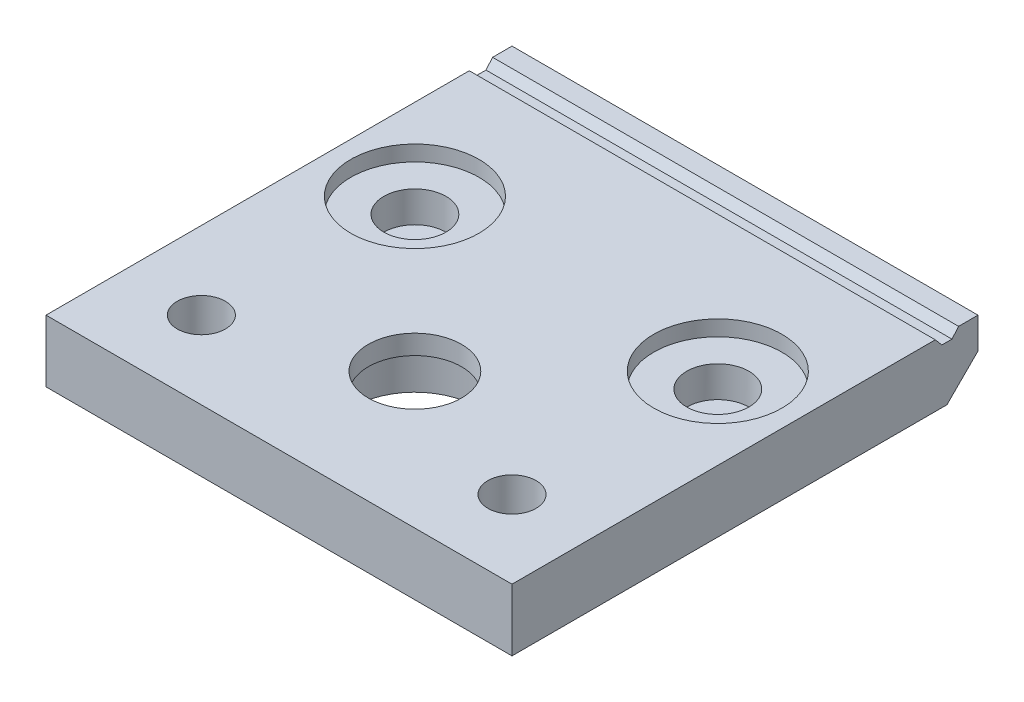
ISO-10303-21;
HEADER;
FILE_DESCRIPTION(('STEP AP214'),'2;1');
FILE_NAME('part.step','',(''),(''),'','','');
FILE_SCHEMA(('AUTOMOTIVE_DESIGN { 1 0 10303 214 1 1 1 1 }'));
ENDSEC;
DATA;
#1=APPLICATION_CONTEXT('core data for automotive mechanical design processes');
#2=APPLICATION_PROTOCOL_DEFINITION('international standard','automotive_design',2000,#1);
#3=PRODUCT_CONTEXT('',#1,'mechanical');
#4=PRODUCT('Part','Part','',(#3));
#5=PRODUCT_RELATED_PRODUCT_CATEGORY('part','',(#4));
#6=PRODUCT_DEFINITION_FORMATION('','',#4);
#7=PRODUCT_DEFINITION_CONTEXT('part definition',#1,'design');
#8=PRODUCT_DEFINITION('design','',#6,#7);
#9=PRODUCT_DEFINITION_SHAPE('','',#8);
#10=(LENGTH_UNIT() NAMED_UNIT(*) SI_UNIT(.MILLI.,.METRE.));
#11=(NAMED_UNIT(*) PLANE_ANGLE_UNIT() SI_UNIT($,.RADIAN.));
#12=(NAMED_UNIT(*) SI_UNIT($,.STERADIAN.) SOLID_ANGLE_UNIT());
#13=UNCERTAINTY_MEASURE_WITH_UNIT(LENGTH_MEASURE(1.E-05),#10,'distance_accuracy_value','');
#14=(GEOMETRIC_REPRESENTATION_CONTEXT(3) GLOBAL_UNCERTAINTY_ASSIGNED_CONTEXT((#13)) GLOBAL_UNIT_ASSIGNED_CONTEXT((#10,
#11,#12)) REPRESENTATION_CONTEXT('',''));
#15=CARTESIAN_POINT('',(0.,0.,0.));
#16=DIRECTION('',(0.,0.,1.));
#17=DIRECTION('',(1.,0.,0.));
#18=AXIS2_PLACEMENT_3D('',#15,#16,#17);
#19=CARTESIAN_POINT('',(0.,8.,0.));
#20=DIRECTION('',(0.,1.,0.));
#21=DIRECTION('',(0.,0.,1.));
#22=AXIS2_PLACEMENT_3D('',#19,#20,#21);
#23=PLANE('',#22);
#24=DIRECTION('',(1.,0.,0.));
#25=VECTOR('',#24,1.);
#26=CARTESIAN_POINT('',(-30.,8.,-24.5));
#27=LINE('',#26,#25);
#28=CARTESIAN_POINT('',(-30.,8.,-24.5));
#29=VERTEX_POINT('',#28);
#30=CARTESIAN_POINT('',(30.,8.,-24.5));
#31=VERTEX_POINT('',#30);
#32=EDGE_CURVE('E141',#29,#31,#27,.T.);
#33=ORIENTED_EDGE('',*,*,#32,.F.);
#34=DIRECTION('',(0.,0.,1.));
#35=VECTOR('',#34,1.);
#36=CARTESIAN_POINT('',(-30.,8.,0.));
#37=LINE('',#36,#35);
#38=CARTESIAN_POINT('',(-30.,8.,30.));
#39=VERTEX_POINT('',#38);
#40=EDGE_CURVE('E132',#29,#39,#37,.T.);
#41=ORIENTED_EDGE('',*,*,#40,.T.);
#42=DIRECTION('',(1.,0.,0.));
#43=VECTOR('',#42,1.);
#44=CARTESIAN_POINT('',(0.,8.,30.));
#45=LINE('',#44,#43);
#46=CARTESIAN_POINT('',(30.,8.,30.));
#47=VERTEX_POINT('',#46);
#48=EDGE_CURVE('E209',#39,#47,#45,.T.);
#49=ORIENTED_EDGE('',*,*,#48,.T.);
#50=DIRECTION('',(0.,0.,1.));
#51=VECTOR('',#50,1.);
#52=CARTESIAN_POINT('',(30.,8.,0.));
#53=LINE('',#52,#51);
#54=EDGE_CURVE('E198',#31,#47,#53,.T.);
#55=ORIENTED_EDGE('',*,*,#54,.F.);
#56=EDGE_LOOP('',(#33,#41,#49,#55));
#57=FACE_BOUND('',#56,.T.);
#58=CARTESIAN_POINT('',(-20.,8.,20.));
#59=DIRECTION('',(0.,-1.,0.));
#60=DIRECTION('',(0.,0.,-1.));
#61=AXIS2_PLACEMENT_3D('',#58,#59,#60);
#62=CIRCLE('',#61,3.1);
#63=CARTESIAN_POINT('',(-20.,8.,16.9));
#64=VERTEX_POINT('',#63);
#65=EDGE_CURVE('E153',#64,#64,#62,.T.);
#66=ORIENTED_EDGE('',*,*,#65,.T.);
#67=EDGE_LOOP('',(#66));
#68=FACE_BOUND('',#67,.T.);
#69=CARTESIAN_POINT('',(0.,8.,12.5));
#70=DIRECTION('',(0.,1.,0.));
#71=DIRECTION('',(0.,0.,1.));
#72=AXIS2_PLACEMENT_3D('',#69,#70,#71);
#73=CIRCLE('',#72,6.);
#74=CARTESIAN_POINT('',(0.,8.,18.5));
#75=VERTEX_POINT('',#74);
#76=EDGE_CURVE('E195',#75,#75,#73,.T.);
#77=ORIENTED_EDGE('',*,*,#76,.F.);
#78=EDGE_LOOP('',(#77));
#79=FACE_BOUND('',#78,.T.);
#80=CARTESIAN_POINT('',(19.5,8.,-6.99999999999999));
#81=DIRECTION('',(0.,1.,0.));
#82=DIRECTION('',(0.,0.,1.));
#83=AXIS2_PLACEMENT_3D('',#80,#81,#82);
#84=CIRCLE('',#83,8.25);
#85=CARTESIAN_POINT('',(19.5,8.,1.25000000000001));
#86=VERTEX_POINT('',#85);
#87=EDGE_CURVE('E165',#86,#86,#84,.T.);
#88=ORIENTED_EDGE('',*,*,#87,.F.);
#89=EDGE_LOOP('',(#88));
#90=FACE_BOUND('',#89,.T.);
#91=CARTESIAN_POINT('',(-19.5,8.,-6.99999999999999));
#92=DIRECTION('',(0.,1.,0.));
#93=DIRECTION('',(0.,0.,1.));
#94=AXIS2_PLACEMENT_3D('',#91,#92,#93);
#95=CIRCLE('',#94,8.25);
#96=CARTESIAN_POINT('',(-19.5,8.,1.25000000000001));
#97=VERTEX_POINT('',#96);
#98=EDGE_CURVE('E170',#97,#97,#95,.T.);
#99=ORIENTED_EDGE('',*,*,#98,.F.);
#100=EDGE_LOOP('',(#99));
#101=FACE_BOUND('',#100,.T.);
#102=CARTESIAN_POINT('',(20.,8.,20.));
#103=DIRECTION('',(0.,-1.,0.));
#104=DIRECTION('',(0.,0.,-1.));
#105=AXIS2_PLACEMENT_3D('',#102,#103,#104);
#106=CIRCLE('',#105,3.1);
#107=CARTESIAN_POINT('',(20.,8.,16.9));
#108=VERTEX_POINT('',#107);
#109=EDGE_CURVE('E162',#108,#108,#106,.T.);
#110=ORIENTED_EDGE('',*,*,#109,.T.);
#111=EDGE_LOOP('',(#110));
#112=FACE_BOUND('',#111,.T.);
#113=ADVANCED_FACE('F41',(#57,#68,#79,#90,#101,#112),#23,.T.);
#114=DIRECTION('',(1.,0.,0.));
#115=VECTOR('',#114,1.);
#116=CARTESIAN_POINT('',(-30.,8.,-27.5));
#117=LINE('',#116,#115);
#118=CARTESIAN_POINT('',(-30.,8.,-27.5));
#119=VERTEX_POINT('',#118);
#120=CARTESIAN_POINT('',(30.,8.,-27.5));
#121=VERTEX_POINT('',#120);
#122=EDGE_CURVE('E144',#119,#121,#117,.T.);
#123=ORIENTED_EDGE('',*,*,#122,.T.);
#124=CARTESIAN_POINT('',(30.,8.,-30.));
#125=VERTEX_POINT('',#124);
#126=EDGE_CURVE('E200',#125,#121,#53,.T.);
#127=ORIENTED_EDGE('',*,*,#126,.F.);
#128=DIRECTION('',(1.,0.,0.));
#129=VECTOR('',#128,1.);
#130=CARTESIAN_POINT('',(0.,8.,-30.));
#131=LINE('',#130,#129);
#132=CARTESIAN_POINT('',(-30.,8.,-30.));
#133=VERTEX_POINT('',#132);
#134=EDGE_CURVE('E203',#133,#125,#131,.T.);
#135=ORIENTED_EDGE('',*,*,#134,.F.);
#136=EDGE_CURVE('E206',#133,#119,#37,.T.);
#137=ORIENTED_EDGE('',*,*,#136,.T.);
#138=EDGE_LOOP('',(#123,#127,#135,#137));
#139=FACE_BOUND('',#138,.T.);
#140=ADVANCED_FACE('F259',(#139),#23,.T.);
#141=CARTESIAN_POINT('',(30.,8.,0.));
#142=DIRECTION('',(1.,0.,0.));
#143=DIRECTION('',(0.,0.,-1.));
#144=AXIS2_PLACEMENT_3D('',#141,#142,#143);
#145=PLANE('',#144);
#146=DIRECTION('',(0.,-0.761939317759459,-0.647648420095541));
#147=VECTOR('',#146,1.);
#148=CARTESIAN_POINT('',(30.,7.,-25.35));
#149=LINE('',#148,#147);
#150=CARTESIAN_POINT('',(30.,7.,-25.35));
#151=VERTEX_POINT('',#150);
#152=EDGE_CURVE('E118',#31,#151,#149,.T.);
#153=ORIENTED_EDGE('',*,*,#152,.F.);
#154=ORIENTED_EDGE('',*,*,#54,.T.);
#155=DIRECTION('',(0.,-1.,0.));
#156=VECTOR('',#155,1.);
#157=CARTESIAN_POINT('',(30.,8.,30.));
#158=LINE('',#157,#156);
#159=CARTESIAN_POINT('',(30.,0.,30.));
#160=VERTEX_POINT('',#159);
#161=EDGE_CURVE('E212',#47,#160,#158,.T.);
#162=ORIENTED_EDGE('',*,*,#161,.T.);
#163=DIRECTION('',(0.,0.,1.));
#164=VECTOR('',#163,1.);
#165=CARTESIAN_POINT('',(30.,0.,0.));
#166=LINE('',#165,#164);
#167=CARTESIAN_POINT('',(30.,0.,-26.));
#168=VERTEX_POINT('',#167);
#169=EDGE_CURVE('E192',#168,#160,#166,.T.);
#170=ORIENTED_EDGE('',*,*,#169,.F.);
#171=DIRECTION('',(0.,0.707106781186549,-0.707106781186546));
#172=VECTOR('',#171,1.);
#173=CARTESIAN_POINT('',(30.,-8.99999999999999,-17.));
#174=LINE('',#173,#172);
#175=CARTESIAN_POINT('',(30.,4.00000000000001,-30.));
#176=VERTEX_POINT('',#175);
#177=EDGE_CURVE('E234',#168,#176,#174,.T.);
#178=ORIENTED_EDGE('',*,*,#177,.T.);
#179=DIRECTION('',(0.,-1.,0.));
#180=VECTOR('',#179,1.);
#181=CARTESIAN_POINT('',(30.,8.,-30.));
#182=LINE('',#181,#180);
#183=EDGE_CURVE('E225',#125,#176,#182,.T.);
#184=ORIENTED_EDGE('',*,*,#183,.F.);
#185=ORIENTED_EDGE('',*,*,#126,.T.);
#186=DIRECTION('',(0.,0.76193931775946,-0.64764842009554));
#187=VECTOR('',#186,1.);
#188=CARTESIAN_POINT('',(30.,8.,-27.5));
#189=LINE('',#188,#187);
#190=CARTESIAN_POINT('',(30.,7.,-26.65));
#191=VERTEX_POINT('',#190);
#192=EDGE_CURVE('E133',#191,#121,#189,.T.);
#193=ORIENTED_EDGE('',*,*,#192,.F.);
#194=DIRECTION('',(0.,0.,-1.));
#195=VECTOR('',#194,1.);
#196=CARTESIAN_POINT('',(30.,7.,-26.65));
#197=LINE('',#196,#195);
#198=EDGE_CURVE('E135',#151,#191,#197,.T.);
#199=ORIENTED_EDGE('',*,*,#198,.F.);
#200=EDGE_LOOP('',(#153,#154,#162,#170,#178,#184,#185,#193,#199));
#201=FACE_BOUND('',#200,.T.);
#202=ADVANCED_FACE('F237',(#201),#145,.T.);
#203=CARTESIAN_POINT('',(0.,8.,-30.));
#204=DIRECTION('',(0.,0.,-1.));
#205=DIRECTION('',(-1.,0.,0.));
#206=AXIS2_PLACEMENT_3D('',#203,#204,#205);
#207=PLANE('',#206);
#208=ORIENTED_EDGE('',*,*,#183,.T.);
#209=DIRECTION('',(-1.,0.,0.));
#210=VECTOR('',#209,1.);
#211=CARTESIAN_POINT('',(-30.,4.00000000000001,-30.));
#212=LINE('',#211,#210);
#213=CARTESIAN_POINT('',(-30.,4.00000000000001,-30.));
#214=VERTEX_POINT('',#213);
#215=EDGE_CURVE('E50',#176,#214,#212,.T.);
#216=ORIENTED_EDGE('',*,*,#215,.T.);
#217=DIRECTION('',(0.,-1.,0.));
#218=VECTOR('',#217,1.);
#219=CARTESIAN_POINT('',(-30.,8.,-30.));
#220=LINE('',#219,#218);
#221=EDGE_CURVE('E223',#133,#214,#220,.T.);
#222=ORIENTED_EDGE('',*,*,#221,.F.);
#223=ORIENTED_EDGE('',*,*,#134,.T.);
#224=EDGE_LOOP('',(#208,#216,#222,#223));
#225=FACE_BOUND('',#224,.T.);
#226=ADVANCED_FACE('F241',(#225),#207,.T.);
#227=CARTESIAN_POINT('',(-30.,8.,0.));
#228=DIRECTION('',(1.,0.,0.));
#229=DIRECTION('',(0.,0.,-1.));
#230=AXIS2_PLACEMENT_3D('',#227,#228,#229);
#231=PLANE('',#230);
#232=ORIENTED_EDGE('',*,*,#40,.F.);
#233=DIRECTION('',(0.,-0.761939317759459,-0.647648420095541));
#234=VECTOR('',#233,1.);
#235=CARTESIAN_POINT('',(-30.,7.,-25.35));
#236=LINE('',#235,#234);
#237=CARTESIAN_POINT('',(-30.,7.,-25.35));
#238=VERTEX_POINT('',#237);
#239=EDGE_CURVE('E115',#29,#238,#236,.T.);
#240=ORIENTED_EDGE('',*,*,#239,.T.);
#241=DIRECTION('',(0.,0.,-1.));
#242=VECTOR('',#241,1.);
#243=CARTESIAN_POINT('',(-30.,7.,-26.65));
#244=LINE('',#243,#242);
#245=CARTESIAN_POINT('',(-30.,7.,-26.65));
#246=VERTEX_POINT('',#245);
#247=EDGE_CURVE('E125',#238,#246,#244,.T.);
#248=ORIENTED_EDGE('',*,*,#247,.T.);
#249=DIRECTION('',(0.,0.76193931775946,-0.64764842009554));
#250=VECTOR('',#249,1.);
#251=CARTESIAN_POINT('',(-30.,8.,-27.5));
#252=LINE('',#251,#250);
#253=EDGE_CURVE('E57',#246,#119,#252,.T.);
#254=ORIENTED_EDGE('',*,*,#253,.T.);
#255=ORIENTED_EDGE('',*,*,#136,.F.);
#256=ORIENTED_EDGE('',*,*,#221,.T.);
#257=DIRECTION('',(0.,-0.707106781186549,0.707106781186546));
#258=VECTOR('',#257,1.);
#259=CARTESIAN_POINT('',(-30.,0.,-26.));
#260=LINE('',#259,#258);
#261=CARTESIAN_POINT('',(-30.,0.,-26.));
#262=VERTEX_POINT('',#261);
#263=EDGE_CURVE('E11',#214,#262,#260,.T.);
#264=ORIENTED_EDGE('',*,*,#263,.T.);
#265=DIRECTION('',(0.,0.,1.));
#266=VECTOR('',#265,1.);
#267=CARTESIAN_POINT('',(-30.,0.,0.));
#268=LINE('',#267,#266);
#269=CARTESIAN_POINT('',(-30.,0.,30.));
#270=VERTEX_POINT('',#269);
#271=EDGE_CURVE('E214',#262,#270,#268,.T.);
#272=ORIENTED_EDGE('',*,*,#271,.T.);
#273=DIRECTION('',(0.,-1.,0.));
#274=VECTOR('',#273,1.);
#275=CARTESIAN_POINT('',(-30.,8.,30.));
#276=LINE('',#275,#274);
#277=EDGE_CURVE('E220',#39,#270,#276,.T.);
#278=ORIENTED_EDGE('',*,*,#277,.F.);
#279=EDGE_LOOP('',(#232,#240,#248,#254,#255,#256,#264,#272,#278));
#280=FACE_BOUND('',#279,.T.);
#281=ADVANCED_FACE('F130',(#280),#231,.F.);
#282=CARTESIAN_POINT('',(0.,8.,30.));
#283=DIRECTION('',(0.,0.,-1.));
#284=DIRECTION('',(-1.,0.,0.));
#285=AXIS2_PLACEMENT_3D('',#282,#283,#284);
#286=PLANE('',#285);
#287=DIRECTION('',(1.,0.,0.));
#288=VECTOR('',#287,1.);
#289=CARTESIAN_POINT('',(0.,0.,30.));
#290=LINE('',#289,#288);
#291=EDGE_CURVE('E199',#270,#160,#290,.T.);
#292=ORIENTED_EDGE('',*,*,#291,.T.);
#293=ORIENTED_EDGE('',*,*,#161,.F.);
#294=ORIENTED_EDGE('',*,*,#48,.F.);
#295=ORIENTED_EDGE('',*,*,#277,.T.);
#296=EDGE_LOOP('',(#292,#293,#294,#295));
#297=FACE_BOUND('',#296,.T.);
#298=ADVANCED_FACE('F252',(#297),#286,.F.);
#299=CARTESIAN_POINT('',(0.,8.,12.5));
#300=DIRECTION('',(0.,-1.,0.));
#301=DIRECTION('',(0.,0.,-1.));
#302=AXIS2_PLACEMENT_3D('',#299,#300,#301);
#303=CYLINDRICAL_SURFACE('',#302,6.);
#304=CARTESIAN_POINT('',(0.,5.5,12.5));
#305=DIRECTION('',(0.,1.,0.));
#306=DIRECTION('',(0.,0.,1.));
#307=AXIS2_PLACEMENT_3D('',#304,#305,#306);
#308=CIRCLE('',#307,6.);
#309=CARTESIAN_POINT('',(0.,5.5,18.5));
#310=VERTEX_POINT('',#309);
#311=EDGE_CURVE('E178',#310,#310,#308,.T.);
#312=ORIENTED_EDGE('',*,*,#311,.F.);
#313=EDGE_LOOP('',(#312));
#314=FACE_BOUND('',#313,.T.);
#315=ORIENTED_EDGE('',*,*,#76,.T.);
#316=EDGE_LOOP('',(#315));
#317=FACE_BOUND('',#316,.T.);
#318=ADVANCED_FACE('F274',(#314,#317),#303,.F.);
#319=CARTESIAN_POINT('',(0.,0.,0.));
#320=DIRECTION('',(0.,1.,0.));
#321=DIRECTION('',(0.,0.,1.));
#322=AXIS2_PLACEMENT_3D('',#319,#320,#321);
#323=PLANE('',#322);
#324=CARTESIAN_POINT('',(-20.,0.,20.));
#325=DIRECTION('',(0.,-1.,0.));
#326=DIRECTION('',(0.,0.,-1.));
#327=AXIS2_PLACEMENT_3D('',#324,#325,#326);
#328=CIRCLE('',#327,6.25);
#329=CARTESIAN_POINT('',(-20.,0.,13.75));
#330=VERTEX_POINT('',#329);
#331=EDGE_CURVE('E143',#330,#330,#328,.T.);
#332=ORIENTED_EDGE('',*,*,#331,.F.);
#333=EDGE_LOOP('',(#332));
#334=FACE_BOUND('',#333,.T.);
#335=CARTESIAN_POINT('',(20.,0.,20.));
#336=DIRECTION('',(0.,-1.,0.));
#337=DIRECTION('',(0.,0.,-1.));
#338=AXIS2_PLACEMENT_3D('',#335,#336,#337);
#339=CIRCLE('',#338,6.25);
#340=CARTESIAN_POINT('',(20.,0.,13.75));
#341=VERTEX_POINT('',#340);
#342=EDGE_CURVE('E156',#341,#341,#339,.T.);
#343=ORIENTED_EDGE('',*,*,#342,.F.);
#344=EDGE_LOOP('',(#343));
#345=FACE_BOUND('',#344,.T.);
#346=CARTESIAN_POINT('',(0.,0.,12.5));
#347=DIRECTION('',(0.,1.,0.));
#348=DIRECTION('',(0.,0.,1.));
#349=AXIS2_PLACEMENT_3D('',#346,#347,#348);
#350=CIRCLE('',#349,8.);
#351=CARTESIAN_POINT('',(0.,0.,20.5));
#352=VERTEX_POINT('',#351);
#353=EDGE_CURVE('E182',#352,#352,#350,.T.);
#354=ORIENTED_EDGE('',*,*,#353,.T.);
#355=EDGE_LOOP('',(#354));
#356=FACE_BOUND('',#355,.T.);
#357=ORIENTED_EDGE('',*,*,#271,.F.);
#358=DIRECTION('',(1.,0.,0.));
#359=VECTOR('',#358,1.);
#360=CARTESIAN_POINT('',(30.,0.,-26.));
#361=LINE('',#360,#359);
#362=EDGE_CURVE('E227',#262,#168,#361,.T.);
#363=ORIENTED_EDGE('',*,*,#362,.T.);
#364=ORIENTED_EDGE('',*,*,#169,.T.);
#365=ORIENTED_EDGE('',*,*,#291,.F.);
#366=EDGE_LOOP('',(#357,#363,#364,#365));
#367=FACE_BOUND('',#366,.T.);
#368=ADVANCED_FACE('F248',(#334,#345,#356,#367),#323,.F.);
#369=CARTESIAN_POINT('',(0.,5.5,12.5));
#370=DIRECTION('',(0.,-1.,0.));
#371=DIRECTION('',(0.,0.,-1.));
#372=AXIS2_PLACEMENT_3D('',#369,#370,#371);
#373=CYLINDRICAL_SURFACE('',#372,8.);
#374=CARTESIAN_POINT('',(0.,5.5,12.5));
#375=DIRECTION('',(0.,1.,0.));
#376=DIRECTION('',(0.,0.,1.));
#377=AXIS2_PLACEMENT_3D('',#374,#375,#376);
#378=CIRCLE('',#377,8.);
#379=CARTESIAN_POINT('',(0.,5.5,20.5));
#380=VERTEX_POINT('',#379);
#381=EDGE_CURVE('E181',#380,#380,#378,.T.);
#382=ORIENTED_EDGE('',*,*,#381,.T.);
#383=EDGE_LOOP('',(#382));
#384=FACE_BOUND('',#383,.T.);
#385=ORIENTED_EDGE('',*,*,#353,.F.);
#386=EDGE_LOOP('',(#385));
#387=FACE_BOUND('',#386,.T.);
#388=ADVANCED_FACE('F273',(#384,#387),#373,.F.);
#389=CARTESIAN_POINT('',(0.,5.5,0.));
#390=DIRECTION('',(0.,1.,0.));
#391=DIRECTION('',(0.,0.,1.));
#392=AXIS2_PLACEMENT_3D('',#389,#390,#391);
#393=PLANE('',#392);
#394=ORIENTED_EDGE('',*,*,#311,.T.);
#395=EDGE_LOOP('',(#394));
#396=FACE_BOUND('',#395,.T.);
#397=ORIENTED_EDGE('',*,*,#381,.F.);
#398=EDGE_LOOP('',(#397));
#399=FACE_BOUND('',#398,.T.);
#400=ADVANCED_FACE('F313',(#396,#399),#393,.F.);
#401=CARTESIAN_POINT('',(-19.5,6.,-6.99999999999999));
#402=DIRECTION('',(0.,1.,0.));
#403=DIRECTION('',(0.,0.,1.));
#404=AXIS2_PLACEMENT_3D('',#401,#402,#403);
#405=PLANE('',#404);
#406=CARTESIAN_POINT('',(-19.5,6.,-6.99999999999999));
#407=DIRECTION('',(0.,1.,0.));
#408=DIRECTION('',(0.,0.,1.));
#409=AXIS2_PLACEMENT_3D('',#406,#407,#408);
#410=CIRCLE('',#409,8.25);
#411=CARTESIAN_POINT('',(-19.5,6.,1.25000000000001));
#412=VERTEX_POINT('',#411);
#413=EDGE_CURVE('E166',#412,#412,#410,.T.);
#414=ORIENTED_EDGE('',*,*,#413,.T.);
#415=EDGE_LOOP('',(#414));
#416=FACE_BOUND('',#415,.T.);
#417=CARTESIAN_POINT('',(-19.5,6.,-6.99999999999999));
#418=DIRECTION('',(0.,1.,0.));
#419=DIRECTION('',(0.,0.,1.));
#420=AXIS2_PLACEMENT_3D('',#417,#418,#419);
#421=CIRCLE('',#420,4.);
#422=CARTESIAN_POINT('',(-19.5,6.,-2.99999999999999));
#423=VERTEX_POINT('',#422);
#424=EDGE_CURVE('E169',#423,#423,#421,.F.);
#425=ORIENTED_EDGE('',*,*,#424,.T.);
#426=EDGE_LOOP('',(#425));
#427=FACE_BOUND('',#426,.T.);
#428=ADVANCED_FACE('F319',(#416,#427),#405,.T.);
#429=CARTESIAN_POINT('',(-19.5,6.,-6.99999999999999));
#430=DIRECTION('',(0.,1.,0.));
#431=DIRECTION('',(0.,0.,1.));
#432=AXIS2_PLACEMENT_3D('',#429,#430,#431);
#433=CYLINDRICAL_SURFACE('',#432,8.25);
#434=ORIENTED_EDGE('',*,*,#413,.F.);
#435=EDGE_LOOP('',(#434));
#436=FACE_BOUND('',#435,.T.);
#437=ORIENTED_EDGE('',*,*,#98,.T.);
#438=EDGE_LOOP('',(#437));
#439=FACE_BOUND('',#438,.T.);
#440=ADVANCED_FACE('F345',(#436,#439),#433,.F.);
#441=CARTESIAN_POINT('',(19.5,6.,-6.99999999999999));
#442=DIRECTION('',(0.,1.,0.));
#443=DIRECTION('',(0.,0.,1.));
#444=AXIS2_PLACEMENT_3D('',#441,#442,#443);
#445=PLANE('',#444);
#446=CARTESIAN_POINT('',(19.5,6.,-6.99999999999999));
#447=DIRECTION('',(0.,1.,0.));
#448=DIRECTION('',(0.,0.,1.));
#449=AXIS2_PLACEMENT_3D('',#446,#447,#448);
#450=CIRCLE('',#449,8.25);
#451=CARTESIAN_POINT('',(19.5,6.,1.25000000000001));
#452=VERTEX_POINT('',#451);
#453=EDGE_CURVE('E173',#452,#452,#450,.T.);
#454=ORIENTED_EDGE('',*,*,#453,.T.);
#455=EDGE_LOOP('',(#454));
#456=FACE_BOUND('',#455,.T.);
#457=CARTESIAN_POINT('',(19.5,6.,-6.99999999999999));
#458=DIRECTION('',(0.,1.,0.));
#459=DIRECTION('',(0.,0.,1.));
#460=AXIS2_PLACEMENT_3D('',#457,#458,#459);
#461=CIRCLE('',#460,4.);
#462=CARTESIAN_POINT('',(19.5,6.,-2.99999999999999));
#463=VERTEX_POINT('',#462);
#464=EDGE_CURVE('E188',#463,#463,#461,.F.);
#465=ORIENTED_EDGE('',*,*,#464,.T.);
#466=EDGE_LOOP('',(#465));
#467=FACE_BOUND('',#466,.T.);
#468=ADVANCED_FACE('F343',(#456,#467),#445,.T.);
#469=CARTESIAN_POINT('',(19.5,6.,-6.99999999999999));
#470=DIRECTION('',(0.,1.,0.));
#471=DIRECTION('',(0.,0.,1.));
#472=AXIS2_PLACEMENT_3D('',#469,#470,#471);
#473=CYLINDRICAL_SURFACE('',#472,8.25);
#474=ORIENTED_EDGE('',*,*,#453,.F.);
#475=EDGE_LOOP('',(#474));
#476=FACE_BOUND('',#475,.T.);
#477=ORIENTED_EDGE('',*,*,#87,.T.);
#478=EDGE_LOOP('',(#477));
#479=FACE_BOUND('',#478,.T.);
#480=ADVANCED_FACE('F328',(#476,#479),#473,.F.);
#481=CARTESIAN_POINT('',(-19.5,2.,-6.99999999999999));
#482=DIRECTION('',(0.,1.,0.));
#483=DIRECTION('',(0.,0.,1.));
#484=AXIS2_PLACEMENT_3D('',#481,#482,#483);
#485=PLANE('',#484);
#486=CARTESIAN_POINT('',(-19.5,2.,-6.99999999999999));
#487=DIRECTION('',(0.,1.,0.));
#488=DIRECTION('',(0.,0.,1.));
#489=AXIS2_PLACEMENT_3D('',#486,#487,#488);
#490=CIRCLE('',#489,4.);
#491=CARTESIAN_POINT('',(-19.5,2.,-2.99999999999999));
#492=VERTEX_POINT('',#491);
#493=EDGE_CURVE('E189',#492,#492,#490,.T.);
#494=ORIENTED_EDGE('',*,*,#493,.T.);
#495=EDGE_LOOP('',(#494));
#496=FACE_BOUND('',#495,.T.);
#497=ADVANCED_FACE('F324',(#496),#485,.T.);
#498=CARTESIAN_POINT('',(-19.5,2.,-6.99999999999999));
#499=DIRECTION('',(0.,1.,0.));
#500=DIRECTION('',(0.,0.,1.));
#501=AXIS2_PLACEMENT_3D('',#498,#499,#500);
#502=CYLINDRICAL_SURFACE('',#501,4.);
#503=ORIENTED_EDGE('',*,*,#493,.F.);
#504=EDGE_LOOP('',(#503));
#505=FACE_BOUND('',#504,.T.);
#506=ORIENTED_EDGE('',*,*,#424,.F.);
#507=EDGE_LOOP('',(#506));
#508=FACE_BOUND('',#507,.T.);
#509=ADVANCED_FACE('F327',(#505,#508),#502,.F.);
#510=CARTESIAN_POINT('',(19.5,2.,-6.99999999999999));
#511=DIRECTION('',(0.,-1.,0.));
#512=DIRECTION('',(0.,0.,-1.));
#513=AXIS2_PLACEMENT_3D('',#510,#511,#512);
#514=PLANE('',#513);
#515=CARTESIAN_POINT('',(19.5,2.,-6.99999999999999));
#516=DIRECTION('',(0.,1.,0.));
#517=DIRECTION('',(0.,0.,-1.));
#518=AXIS2_PLACEMENT_3D('',#515,#516,#517);
#519=CIRCLE('',#518,4.);
#520=CARTESIAN_POINT('',(19.5,2.,-11.));
#521=VERTEX_POINT('',#520);
#522=EDGE_CURVE('E185',#521,#521,#519,.T.);
#523=ORIENTED_EDGE('',*,*,#522,.T.);
#524=EDGE_LOOP('',(#523));
#525=FACE_BOUND('',#524,.T.);
#526=ADVANCED_FACE('F331',(#525),#514,.F.);
#527=CARTESIAN_POINT('',(19.5,2.,-6.99999999999999));
#528=DIRECTION('',(0.,1.,0.));
#529=DIRECTION('',(0.,0.,1.));
#530=AXIS2_PLACEMENT_3D('',#527,#528,#529);
#531=CYLINDRICAL_SURFACE('',#530,4.);
#532=ORIENTED_EDGE('',*,*,#522,.F.);
#533=EDGE_LOOP('',(#532));
#534=FACE_BOUND('',#533,.T.);
#535=ORIENTED_EDGE('',*,*,#464,.F.);
#536=EDGE_LOOP('',(#535));
#537=FACE_BOUND('',#536,.T.);
#538=ADVANCED_FACE('F269',(#534,#537),#531,.F.);
#539=CARTESIAN_POINT('',(0.,0.,-26.));
#540=DIRECTION('',(0.,-0.707106781186546,-0.707106781186549));
#541=DIRECTION('',(-1.,0.,0.));
#542=AXIS2_PLACEMENT_3D('',#539,#540,#541);
#543=PLANE('',#542);
#544=ORIENTED_EDGE('',*,*,#263,.F.);
#545=ORIENTED_EDGE('',*,*,#215,.F.);
#546=ORIENTED_EDGE('',*,*,#177,.F.);
#547=ORIENTED_EDGE('',*,*,#362,.F.);
#548=EDGE_LOOP('',(#544,#545,#546,#547));
#549=FACE_BOUND('',#548,.T.);
#550=ADVANCED_FACE('F44',(#549),#543,.T.);
#551=CARTESIAN_POINT('',(20.,0.,20.));
#552=DIRECTION('',(0.,-1.,0.));
#553=DIRECTION('',(0.,0.,-1.));
#554=AXIS2_PLACEMENT_3D('',#551,#552,#553);
#555=CYLINDRICAL_SURFACE('',#554,3.1);
#556=ORIENTED_EDGE('',*,*,#109,.F.);
#557=EDGE_LOOP('',(#556));
#558=FACE_BOUND('',#557,.T.);
#559=CARTESIAN_POINT('',(20.,3.15,20.));
#560=DIRECTION('',(0.,-1.,0.));
#561=DIRECTION('',(0.,0.,-1.));
#562=AXIS2_PLACEMENT_3D('',#559,#560,#561);
#563=CIRCLE('',#562,3.1);
#564=CARTESIAN_POINT('',(20.,3.15,16.9));
#565=VERTEX_POINT('',#564);
#566=EDGE_CURVE('E159',#565,#565,#563,.T.);
#567=ORIENTED_EDGE('',*,*,#566,.T.);
#568=EDGE_LOOP('',(#567));
#569=FACE_BOUND('',#568,.T.);
#570=ADVANCED_FACE('F296',(#558,#569),#555,.F.);
#571=CARTESIAN_POINT('',(20.,0.,20.));
#572=DIRECTION('',(0.,-1.,0.));
#573=DIRECTION('',(0.,0.,-1.));
#574=AXIS2_PLACEMENT_3D('',#571,#572,#573);
#575=CONICAL_SURFACE('',#574,6.25,0.785398163397449);
#576=ORIENTED_EDGE('',*,*,#566,.F.);
#577=EDGE_LOOP('',(#576));
#578=FACE_BOUND('',#577,.T.);
#579=ORIENTED_EDGE('',*,*,#342,.T.);
#580=EDGE_LOOP('',(#579));
#581=FACE_BOUND('',#580,.T.);
#582=ADVANCED_FACE('F299',(#578,#581),#575,.F.);
#583=CARTESIAN_POINT('',(-20.,0.,20.));
#584=DIRECTION('',(0.,-1.,0.));
#585=DIRECTION('',(0.,0.,-1.));
#586=AXIS2_PLACEMENT_3D('',#583,#584,#585);
#587=CYLINDRICAL_SURFACE('',#586,3.1);
#588=ORIENTED_EDGE('',*,*,#65,.F.);
#589=EDGE_LOOP('',(#588));
#590=FACE_BOUND('',#589,.T.);
#591=CARTESIAN_POINT('',(-20.,3.15,20.));
#592=DIRECTION('',(0.,-1.,0.));
#593=DIRECTION('',(0.,0.,-1.));
#594=AXIS2_PLACEMENT_3D('',#591,#592,#593);
#595=CIRCLE('',#594,3.1);
#596=CARTESIAN_POINT('',(-20.,3.15,16.9));
#597=VERTEX_POINT('',#596);
#598=EDGE_CURVE('E150',#597,#597,#595,.T.);
#599=ORIENTED_EDGE('',*,*,#598,.T.);
#600=EDGE_LOOP('',(#599));
#601=FACE_BOUND('',#600,.T.);
#602=ADVANCED_FACE('F305',(#590,#601),#587,.F.);
#603=CARTESIAN_POINT('',(-20.,0.,20.));
#604=DIRECTION('',(0.,-1.,0.));
#605=DIRECTION('',(0.,0.,-1.));
#606=AXIS2_PLACEMENT_3D('',#603,#604,#605);
#607=CONICAL_SURFACE('',#606,6.25,0.785398163397449);
#608=ORIENTED_EDGE('',*,*,#598,.F.);
#609=EDGE_LOOP('',(#608));
#610=FACE_BOUND('',#609,.T.);
#611=ORIENTED_EDGE('',*,*,#331,.T.);
#612=EDGE_LOOP('',(#611));
#613=FACE_BOUND('',#612,.T.);
#614=ADVANCED_FACE('F361',(#610,#613),#607,.F.);
#615=CARTESIAN_POINT('',(-30.,7.,-25.35));
#616=DIRECTION('',(0.,-0.647648420095541,0.761939317759459));
#617=DIRECTION('',(0.,-0.761939317759459,-0.647648420095541));
#618=AXIS2_PLACEMENT_3D('',#615,#616,#617);
#619=PLANE('',#618);
#620=ORIENTED_EDGE('',*,*,#152,.T.);
#621=DIRECTION('',(1.,0.,0.));
#622=VECTOR('',#621,1.);
#623=CARTESIAN_POINT('',(-30.,7.,-25.35));
#624=LINE('',#623,#622);
#625=EDGE_CURVE('E111',#238,#151,#624,.T.);
#626=ORIENTED_EDGE('',*,*,#625,.F.);
#627=ORIENTED_EDGE('',*,*,#239,.F.);
#628=ORIENTED_EDGE('',*,*,#32,.T.);
#629=EDGE_LOOP('',(#620,#626,#627,#628));
#630=FACE_BOUND('',#629,.T.);
#631=ADVANCED_FACE('F113',(#630),#619,.F.);
#632=CARTESIAN_POINT('',(-30.,8.,-27.5));
#633=DIRECTION('',(0.,-0.64764842009554,-0.76193931775946));
#634=DIRECTION('',(0.,0.76193931775946,-0.64764842009554));
#635=AXIS2_PLACEMENT_3D('',#632,#633,#634);
#636=PLANE('',#635);
#637=ORIENTED_EDGE('',*,*,#192,.T.);
#638=ORIENTED_EDGE('',*,*,#122,.F.);
#639=ORIENTED_EDGE('',*,*,#253,.F.);
#640=DIRECTION('',(1.,0.,0.));
#641=VECTOR('',#640,1.);
#642=CARTESIAN_POINT('',(-30.,7.,-26.65));
#643=LINE('',#642,#641);
#644=EDGE_CURVE('E122',#246,#191,#643,.T.);
#645=ORIENTED_EDGE('',*,*,#644,.T.);
#646=EDGE_LOOP('',(#637,#638,#639,#645));
#647=FACE_BOUND('',#646,.T.);
#648=ADVANCED_FACE('F257',(#647),#636,.F.);
#649=CARTESIAN_POINT('',(-30.,7.,-26.65));
#650=DIRECTION('',(0.,-1.,0.));
#651=DIRECTION('',(0.,0.,-1.));
#652=AXIS2_PLACEMENT_3D('',#649,#650,#651);
#653=PLANE('',#652);
#654=ORIENTED_EDGE('',*,*,#198,.T.);
#655=ORIENTED_EDGE('',*,*,#644,.F.);
#656=ORIENTED_EDGE('',*,*,#247,.F.);
#657=ORIENTED_EDGE('',*,*,#625,.T.);
#658=EDGE_LOOP('',(#654,#655,#656,#657));
#659=FACE_BOUND('',#658,.T.);
#660=ADVANCED_FACE('F126',(#659),#653,.F.);
#661=CLOSED_SHELL('',(#113,#140,#202,#226,#281,#298,#318,#368,#388,#400,#428,#440,#468,#480,
#497,#509,#526,#538,#550,#570,#582,#602,#614,#631,#648,#660));
#662=MANIFOLD_SOLID_BREP('B2',#661);
#663=ADVANCED_BREP_SHAPE_REPRESENTATION('',(#18,#662),#14);
#664=SHAPE_DEFINITION_REPRESENTATION(#9,#663);
ENDSEC;
END-ISO-10303-21;
